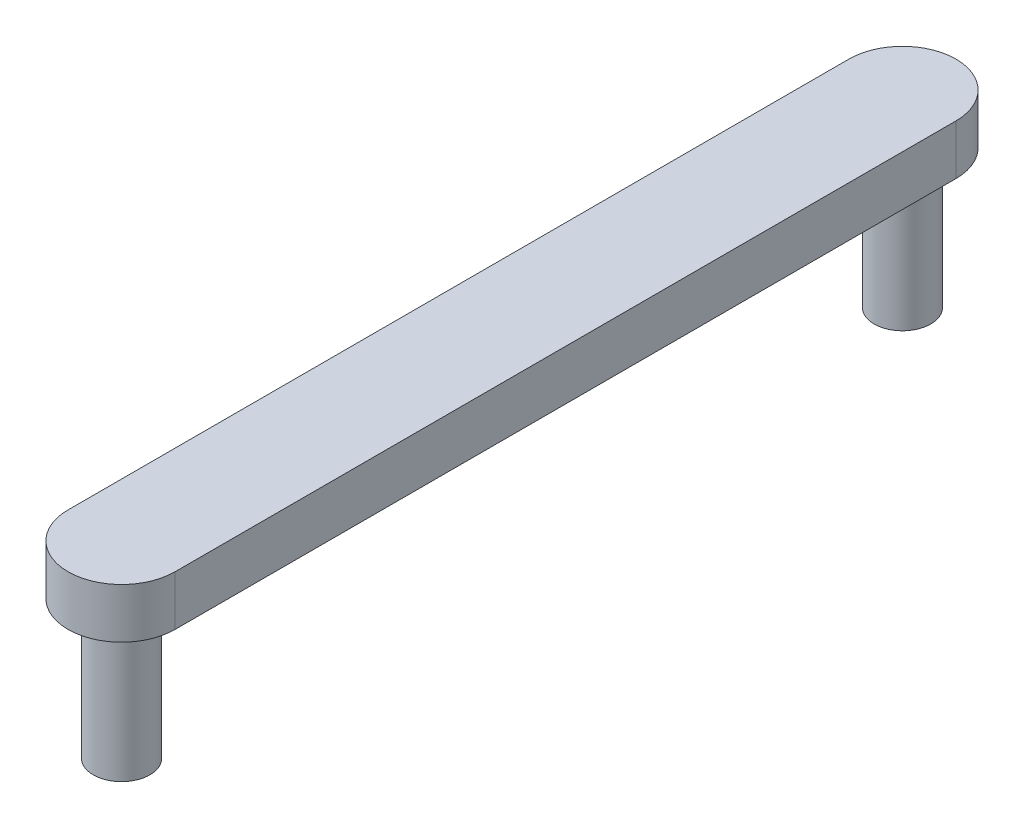
ISO-10303-21;
HEADER;
FILE_DESCRIPTION(('STEP AP214'),'2;1');
FILE_NAME('part.step','',(''),(''),'','','');
FILE_SCHEMA(('AUTOMOTIVE_DESIGN { 1 0 10303 214 1 1 1 1 }'));
ENDSEC;
DATA;
#1=APPLICATION_CONTEXT('core data for automotive mechanical design processes');
#2=APPLICATION_PROTOCOL_DEFINITION('international standard','automotive_design',2000,#1);
#3=PRODUCT_CONTEXT('',#1,'mechanical');
#4=PRODUCT('Part','Part','',(#3));
#5=PRODUCT_RELATED_PRODUCT_CATEGORY('part','',(#4));
#6=PRODUCT_DEFINITION_FORMATION('','',#4);
#7=PRODUCT_DEFINITION_CONTEXT('part definition',#1,'design');
#8=PRODUCT_DEFINITION('design','',#6,#7);
#9=PRODUCT_DEFINITION_SHAPE('','',#8);
#10=(LENGTH_UNIT() NAMED_UNIT(*) SI_UNIT(.MILLI.,.METRE.));
#11=(NAMED_UNIT(*) PLANE_ANGLE_UNIT() SI_UNIT($,.RADIAN.));
#12=(NAMED_UNIT(*) SI_UNIT($,.STERADIAN.) SOLID_ANGLE_UNIT());
#13=UNCERTAINTY_MEASURE_WITH_UNIT(LENGTH_MEASURE(1.E-05),#10,'distance_accuracy_value','');
#14=(GEOMETRIC_REPRESENTATION_CONTEXT(3) GLOBAL_UNCERTAINTY_ASSIGNED_CONTEXT((#13)) GLOBAL_UNIT_ASSIGNED_CONTEXT((#10,
#11,#12)) REPRESENTATION_CONTEXT('',''));
#15=CARTESIAN_POINT('',(0.,0.,0.));
#16=DIRECTION('',(0.,0.,1.));
#17=DIRECTION('',(1.,0.,0.));
#18=AXIS2_PLACEMENT_3D('',#15,#16,#17);
#19=CARTESIAN_POINT('',(0.,4.4,0.));
#20=DIRECTION('',(0.,-1.,0.));
#21=DIRECTION('',(0.,0.,-1.));
#22=AXIS2_PLACEMENT_3D('',#19,#20,#21);
#23=CYLINDRICAL_SURFACE('',#22,0.9);
#24=CARTESIAN_POINT('',(0.,4.4,0.));
#25=DIRECTION('',(0.,1.,0.));
#26=DIRECTION('',(0.,0.,1.));
#27=AXIS2_PLACEMENT_3D('',#24,#25,#26);
#28=CIRCLE('',#27,0.9);
#29=CARTESIAN_POINT('',(0.,4.4,0.9));
#30=VERTEX_POINT('',#29);
#31=EDGE_CURVE('E47',#30,#30,#28,.T.);
#32=ORIENTED_EDGE('',*,*,#31,.F.);
#33=EDGE_LOOP('',(#32));
#34=FACE_BOUND('',#33,.T.);
#35=CARTESIAN_POINT('',(0.,0.,0.));
#36=DIRECTION('',(0.,1.,0.));
#37=DIRECTION('',(0.,0.,1.));
#38=AXIS2_PLACEMENT_3D('',#35,#36,#37);
#39=CIRCLE('',#38,0.9);
#40=CARTESIAN_POINT('',(0.,0.,0.9));
#41=VERTEX_POINT('',#40);
#42=EDGE_CURVE('E116',#41,#41,#39,.T.);
#43=ORIENTED_EDGE('',*,*,#42,.T.);
#44=EDGE_LOOP('',(#43));
#45=FACE_BOUND('',#44,.T.);
#46=ADVANCED_FACE('F39',(#34,#45),#23,.T.);
#47=CARTESIAN_POINT('',(0.,0.,0.));
#48=DIRECTION('',(0.,1.,0.));
#49=DIRECTION('',(0.,0.,1.));
#50=AXIS2_PLACEMENT_3D('',#47,#48,#49);
#51=PLANE('',#50);
#52=ORIENTED_EDGE('',*,*,#42,.F.);
#53=EDGE_LOOP('',(#52));
#54=FACE_BOUND('',#53,.T.);
#55=ADVANCED_FACE('F122',(#54),#51,.F.);
#56=CARTESIAN_POINT('',(0.,5.9875,0.));
#57=DIRECTION('',(0.,-1.,0.));
#58=DIRECTION('',(0.,0.,-1.));
#59=AXIS2_PLACEMENT_3D('',#56,#57,#58);
#60=CYLINDRICAL_SURFACE('',#59,1.7);
#61=CARTESIAN_POINT('',(0.,4.4,0.));
#62=DIRECTION('',(0.,1.,0.));
#63=DIRECTION('',(0.,0.,1.));
#64=AXIS2_PLACEMENT_3D('',#61,#62,#63);
#65=CIRCLE('',#64,1.7);
#66=CARTESIAN_POINT('',(1.7,4.4,0.));
#67=VERTEX_POINT('',#66);
#68=CARTESIAN_POINT('',(-1.7,4.4,0.));
#69=VERTEX_POINT('',#68);
#70=EDGE_CURVE('E106',#67,#69,#65,.T.);
#71=ORIENTED_EDGE('',*,*,#70,.T.);
#72=DIRECTION('',(0.,-1.,0.));
#73=VECTOR('',#72,1.);
#74=CARTESIAN_POINT('',(-1.7,5.9875,0.));
#75=LINE('',#74,#73);
#76=CARTESIAN_POINT('',(-1.7,5.9875,0.));
#77=VERTEX_POINT('',#76);
#78=EDGE_CURVE('E97',#77,#69,#75,.T.);
#79=ORIENTED_EDGE('',*,*,#78,.F.);
#80=CARTESIAN_POINT('',(0.,5.9875,0.));
#81=DIRECTION('',(0.,1.,0.));
#82=DIRECTION('',(0.,0.,1.));
#83=AXIS2_PLACEMENT_3D('',#80,#81,#82);
#84=CIRCLE('',#83,1.7);
#85=CARTESIAN_POINT('',(1.7,5.9875,0.));
#86=VERTEX_POINT('',#85);
#87=EDGE_CURVE('E91',#86,#77,#84,.T.);
#88=ORIENTED_EDGE('',*,*,#87,.F.);
#89=DIRECTION('',(0.,-1.,0.));
#90=VECTOR('',#89,1.);
#91=CARTESIAN_POINT('',(1.7,5.9875,0.));
#92=LINE('',#91,#90);
#93=EDGE_CURVE('E102',#86,#67,#92,.T.);
#94=ORIENTED_EDGE('',*,*,#93,.T.);
#95=EDGE_LOOP('',(#71,#79,#88,#94));
#96=FACE_BOUND('',#95,.T.);
#97=ADVANCED_FACE('F124',(#96),#60,.T.);
#98=CARTESIAN_POINT('',(-1.7,5.9875,0.));
#99=DIRECTION('',(1.,0.,0.));
#100=DIRECTION('',(0.,0.,-1.));
#101=AXIS2_PLACEMENT_3D('',#98,#99,#100);
#102=PLANE('',#101);
#103=DIRECTION('',(0.,0.,1.));
#104=VECTOR('',#103,1.);
#105=CARTESIAN_POINT('',(-1.7,4.4,0.));
#106=LINE('',#105,#104);
#107=CARTESIAN_POINT('',(-1.7,4.4,24.8));
#108=VERTEX_POINT('',#107);
#109=EDGE_CURVE('E96',#69,#108,#106,.T.);
#110=ORIENTED_EDGE('',*,*,#109,.T.);
#111=DIRECTION('',(0.,-1.,0.));
#112=VECTOR('',#111,1.);
#113=CARTESIAN_POINT('',(-1.7,5.9875,24.8));
#114=LINE('',#113,#112);
#115=CARTESIAN_POINT('',(-1.7,5.9875,24.8));
#116=VERTEX_POINT('',#115);
#117=EDGE_CURVE('E94',#116,#108,#114,.T.);
#118=ORIENTED_EDGE('',*,*,#117,.F.);
#119=DIRECTION('',(0.,0.,1.));
#120=VECTOR('',#119,1.);
#121=CARTESIAN_POINT('',(-1.7,5.9875,0.));
#122=LINE('',#121,#120);
#123=EDGE_CURVE('E86',#77,#116,#122,.T.);
#124=ORIENTED_EDGE('',*,*,#123,.F.);
#125=ORIENTED_EDGE('',*,*,#78,.T.);
#126=EDGE_LOOP('',(#110,#118,#124,#125));
#127=FACE_BOUND('',#126,.T.);
#128=ADVANCED_FACE('F95',(#127),#102,.F.);
#129=CARTESIAN_POINT('',(0.,5.9875,24.8));
#130=DIRECTION('',(0.,-1.,0.));
#131=DIRECTION('',(0.,0.,-1.));
#132=AXIS2_PLACEMENT_3D('',#129,#130,#131);
#133=CYLINDRICAL_SURFACE('',#132,1.7);
#134=CARTESIAN_POINT('',(0.,4.4,24.8));
#135=DIRECTION('',(0.,1.,0.));
#136=DIRECTION('',(0.,0.,1.));
#137=AXIS2_PLACEMENT_3D('',#134,#135,#136);
#138=CIRCLE('',#137,1.7);
#139=CARTESIAN_POINT('',(1.7,4.4,24.8));
#140=VERTEX_POINT('',#139);
#141=EDGE_CURVE('E72',#108,#140,#138,.T.);
#142=ORIENTED_EDGE('',*,*,#141,.T.);
#143=DIRECTION('',(0.,-1.,0.));
#144=VECTOR('',#143,1.);
#145=CARTESIAN_POINT('',(1.7,5.9875,24.8));
#146=LINE('',#145,#144);
#147=CARTESIAN_POINT('',(1.7,5.9875,24.8));
#148=VERTEX_POINT('',#147);
#149=EDGE_CURVE('E98',#148,#140,#146,.T.);
#150=ORIENTED_EDGE('',*,*,#149,.F.);
#151=CARTESIAN_POINT('',(0.,5.9875,24.8));
#152=DIRECTION('',(0.,1.,0.));
#153=DIRECTION('',(0.,0.,1.));
#154=AXIS2_PLACEMENT_3D('',#151,#152,#153);
#155=CIRCLE('',#154,1.7);
#156=EDGE_CURVE('E89',#116,#148,#155,.T.);
#157=ORIENTED_EDGE('',*,*,#156,.F.);
#158=ORIENTED_EDGE('',*,*,#117,.T.);
#159=EDGE_LOOP('',(#142,#150,#157,#158));
#160=FACE_BOUND('',#159,.T.);
#161=ADVANCED_FACE('F100',(#160),#133,.T.);
#162=CARTESIAN_POINT('',(1.7,5.9875,0.));
#163=DIRECTION('',(-1.,0.,0.));
#164=DIRECTION('',(0.,0.,1.));
#165=AXIS2_PLACEMENT_3D('',#162,#163,#164);
#166=PLANE('',#165);
#167=DIRECTION('',(0.,0.,-1.));
#168=VECTOR('',#167,1.);
#169=CARTESIAN_POINT('',(1.7,4.4,0.));
#170=LINE('',#169,#168);
#171=EDGE_CURVE('E78',#140,#67,#170,.T.);
#172=ORIENTED_EDGE('',*,*,#171,.T.);
#173=ORIENTED_EDGE('',*,*,#93,.F.);
#174=DIRECTION('',(0.,0.,-1.));
#175=VECTOR('',#174,1.);
#176=CARTESIAN_POINT('',(1.7,5.9875,0.));
#177=LINE('',#176,#175);
#178=EDGE_CURVE('E55',#148,#86,#177,.T.);
#179=ORIENTED_EDGE('',*,*,#178,.F.);
#180=ORIENTED_EDGE('',*,*,#149,.T.);
#181=EDGE_LOOP('',(#172,#173,#179,#180));
#182=FACE_BOUND('',#181,.T.);
#183=ADVANCED_FACE('F137',(#182),#166,.F.);
#184=CARTESIAN_POINT('',(0.,5.9875,0.));
#185=DIRECTION('',(0.,1.,0.));
#186=DIRECTION('',(0.,0.,1.));
#187=AXIS2_PLACEMENT_3D('',#184,#185,#186);
#188=PLANE('',#187);
#189=ORIENTED_EDGE('',*,*,#87,.T.);
#190=ORIENTED_EDGE('',*,*,#123,.T.);
#191=ORIENTED_EDGE('',*,*,#156,.T.);
#192=ORIENTED_EDGE('',*,*,#178,.T.);
#193=EDGE_LOOP('',(#189,#190,#191,#192));
#194=FACE_BOUND('',#193,.T.);
#195=ADVANCED_FACE('F87',(#194),#188,.T.);
#196=CARTESIAN_POINT('',(0.,4.4,0.));
#197=DIRECTION('',(0.,1.,0.));
#198=DIRECTION('',(0.,0.,1.));
#199=AXIS2_PLACEMENT_3D('',#196,#197,#198);
#200=PLANE('',#199);
#201=CARTESIAN_POINT('',(0.,4.4,24.8));
#202=DIRECTION('',(0.,1.,0.));
#203=DIRECTION('',(0.,0.,1.));
#204=AXIS2_PLACEMENT_3D('',#201,#202,#203);
#205=CIRCLE('',#204,0.900000000000004);
#206=CARTESIAN_POINT('',(0.,4.4,25.7));
#207=VERTEX_POINT('',#206);
#208=EDGE_CURVE('E11',#207,#207,#205,.F.);
#209=ORIENTED_EDGE('',*,*,#208,.F.);
#210=EDGE_LOOP('',(#209));
#211=FACE_BOUND('',#210,.T.);
#212=ORIENTED_EDGE('',*,*,#31,.T.);
#213=EDGE_LOOP('',(#212));
#214=FACE_BOUND('',#213,.T.);
#215=ORIENTED_EDGE('',*,*,#70,.F.);
#216=ORIENTED_EDGE('',*,*,#171,.F.);
#217=ORIENTED_EDGE('',*,*,#141,.F.);
#218=ORIENTED_EDGE('',*,*,#109,.F.);
#219=EDGE_LOOP('',(#215,#216,#217,#218));
#220=FACE_BOUND('',#219,.T.);
#221=ADVANCED_FACE('F140',(#211,#214,#220),#200,.F.);
#222=CARTESIAN_POINT('',(0.,4.4,24.8));
#223=DIRECTION('',(0.,-1.,0.));
#224=DIRECTION('',(0.,0.,-1.));
#225=AXIS2_PLACEMENT_3D('',#222,#223,#224);
#226=CYLINDRICAL_SURFACE('',#225,0.900000000000004);
#227=ORIENTED_EDGE('',*,*,#208,.T.);
#228=EDGE_LOOP('',(#227));
#229=FACE_BOUND('',#228,.T.);
#230=CARTESIAN_POINT('',(0.,0.,24.8));
#231=DIRECTION('',(0.,1.,0.));
#232=DIRECTION('',(0.,0.,1.));
#233=AXIS2_PLACEMENT_3D('',#230,#231,#232);
#234=CIRCLE('',#233,0.900000000000004);
#235=CARTESIAN_POINT('',(0.,0.,25.7));
#236=VERTEX_POINT('',#235);
#237=EDGE_CURVE('E109',#236,#236,#234,.T.);
#238=ORIENTED_EDGE('',*,*,#237,.T.);
#239=EDGE_LOOP('',(#238));
#240=FACE_BOUND('',#239,.T.);
#241=ADVANCED_FACE('F143',(#229,#240),#226,.T.);
#242=CARTESIAN_POINT('',(0.,0.,24.8));
#243=DIRECTION('',(0.,1.,0.));
#244=DIRECTION('',(0.,0.,1.));
#245=AXIS2_PLACEMENT_3D('',#242,#243,#244);
#246=PLANE('',#245);
#247=ORIENTED_EDGE('',*,*,#237,.F.);
#248=EDGE_LOOP('',(#247));
#249=FACE_BOUND('',#248,.T.);
#250=ADVANCED_FACE('F147',(#249),#246,.F.);
#251=CLOSED_SHELL('',(#46,#55,#97,#128,#161,#183,#195,#221,#241,#250));
#252=MANIFOLD_SOLID_BREP('B2',#251);
#253=ADVANCED_BREP_SHAPE_REPRESENTATION('',(#18,#252),#14);
#254=SHAPE_DEFINITION_REPRESENTATION(#9,#253);
ENDSEC;
END-ISO-10303-21;
